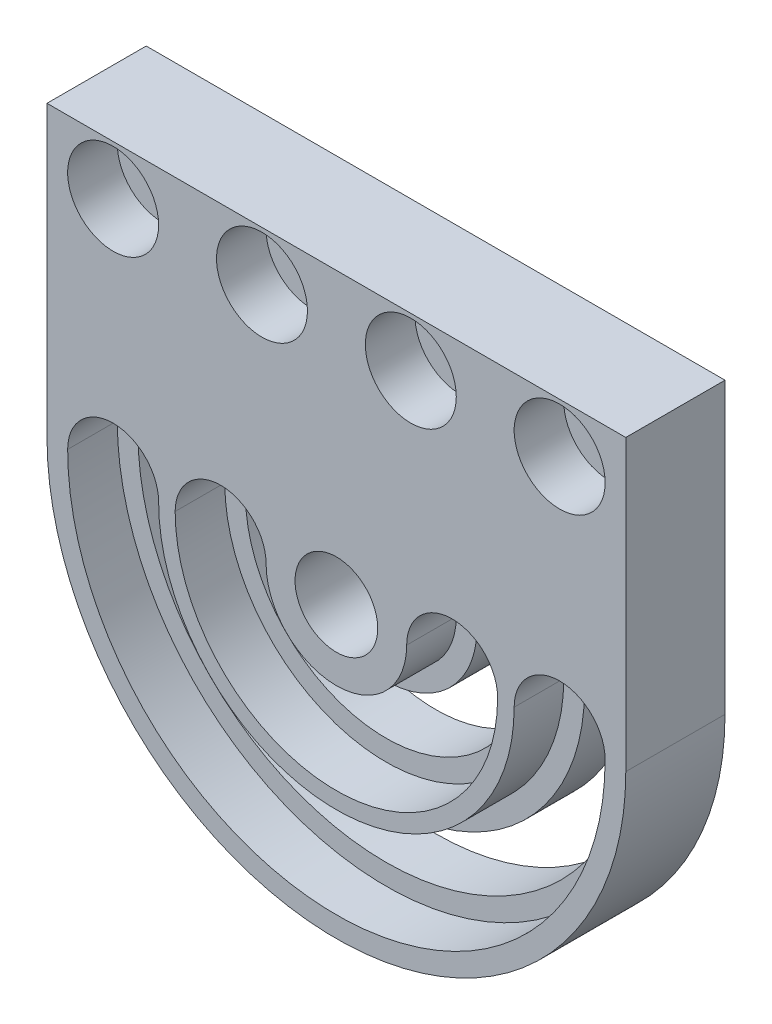
ISO-10303-21;
HEADER;
FILE_DESCRIPTION(('STEP AP214'),'2;1');
FILE_NAME('part.step','',(''),(''),'','','');
FILE_SCHEMA(('AUTOMOTIVE_DESIGN { 1 0 10303 214 1 1 1 1 }'));
ENDSEC;
DATA;
#1=APPLICATION_CONTEXT('core data for automotive mechanical design processes');
#2=APPLICATION_PROTOCOL_DEFINITION('international standard','automotive_design',2000,#1);
#3=PRODUCT_CONTEXT('',#1,'mechanical');
#4=PRODUCT('Part','Part','',(#3));
#5=PRODUCT_RELATED_PRODUCT_CATEGORY('part','',(#4));
#6=PRODUCT_DEFINITION_FORMATION('','',#4);
#7=PRODUCT_DEFINITION_CONTEXT('part definition',#1,'design');
#8=PRODUCT_DEFINITION('design','',#6,#7);
#9=PRODUCT_DEFINITION_SHAPE('','',#8);
#10=(LENGTH_UNIT() NAMED_UNIT(*) SI_UNIT(.MILLI.,.METRE.));
#11=(NAMED_UNIT(*) PLANE_ANGLE_UNIT() SI_UNIT($,.RADIAN.));
#12=(NAMED_UNIT(*) SI_UNIT($,.STERADIAN.) SOLID_ANGLE_UNIT());
#13=UNCERTAINTY_MEASURE_WITH_UNIT(LENGTH_MEASURE(1.E-05),#10,'distance_accuracy_value','');
#14=(GEOMETRIC_REPRESENTATION_CONTEXT(3) GLOBAL_UNCERTAINTY_ASSIGNED_CONTEXT((#13)) GLOBAL_UNIT_ASSIGNED_CONTEXT((#10,
#11,#12)) REPRESENTATION_CONTEXT('',''));
#15=CARTESIAN_POINT('',(0.,0.,0.));
#16=DIRECTION('',(0.,0.,1.));
#17=DIRECTION('',(1.,0.,0.));
#18=AXIS2_PLACEMENT_3D('',#15,#16,#17);
#19=CARTESIAN_POINT('',(-27.,29.,12.));
#20=DIRECTION('',(0.,0.,-1.));
#21=DIRECTION('',(-1.,0.,0.));
#22=AXIS2_PLACEMENT_3D('',#19,#20,#21);
#23=CYLINDRICAL_SURFACE('',#22,3.);
#24=CARTESIAN_POINT('',(-27.,29.,0.));
#25=DIRECTION('',(0.,0.,1.));
#26=DIRECTION('',(1.,0.,0.));
#27=AXIS2_PLACEMENT_3D('',#24,#25,#26);
#28=CIRCLE('',#27,3.);
#29=CARTESIAN_POINT('',(-24.,29.,0.));
#30=VERTEX_POINT('',#29);
#31=EDGE_CURVE('E332',#30,#30,#28,.T.);
#32=ORIENTED_EDGE('',*,*,#31,.F.);
#33=EDGE_LOOP('',(#32));
#34=FACE_BOUND('',#33,.T.);
#35=CARTESIAN_POINT('',(-27.,29.,6.));
#36=DIRECTION('',(0.,0.,1.));
#37=DIRECTION('',(1.,0.,0.));
#38=AXIS2_PLACEMENT_3D('',#35,#36,#37);
#39=CIRCLE('',#38,3.);
#40=CARTESIAN_POINT('',(-24.,29.,6.));
#41=VERTEX_POINT('',#40);
#42=EDGE_CURVE('E37',#41,#41,#39,.T.);
#43=ORIENTED_EDGE('',*,*,#42,.T.);
#44=EDGE_LOOP('',(#43));
#45=FACE_BOUND('',#44,.T.);
#46=ADVANCED_FACE('F33',(#34,#45),#23,.F.);
#47=CARTESIAN_POINT('',(-9.00000000000001,29.,12.));
#48=DIRECTION('',(0.,0.,-1.));
#49=DIRECTION('',(-1.,0.,0.));
#50=AXIS2_PLACEMENT_3D('',#47,#48,#49);
#51=CYLINDRICAL_SURFACE('',#50,3.);
#52=CARTESIAN_POINT('',(-9.00000000000001,29.,0.));
#53=DIRECTION('',(0.,0.,1.));
#54=DIRECTION('',(1.,0.,0.));
#55=AXIS2_PLACEMENT_3D('',#52,#53,#54);
#56=CIRCLE('',#55,3.);
#57=CARTESIAN_POINT('',(-6.,29.,0.));
#58=VERTEX_POINT('',#57);
#59=EDGE_CURVE('E329',#58,#58,#56,.T.);
#60=ORIENTED_EDGE('',*,*,#59,.F.);
#61=EDGE_LOOP('',(#60));
#62=FACE_BOUND('',#61,.T.);
#63=CARTESIAN_POINT('',(-9.00000000000001,29.,6.));
#64=DIRECTION('',(0.,0.,1.));
#65=DIRECTION('',(1.,0.,0.));
#66=AXIS2_PLACEMENT_3D('',#63,#64,#65);
#67=CIRCLE('',#66,3.);
#68=CARTESIAN_POINT('',(-6.,29.,6.));
#69=VERTEX_POINT('',#68);
#70=EDGE_CURVE('E377',#69,#69,#67,.T.);
#71=ORIENTED_EDGE('',*,*,#70,.T.);
#72=EDGE_LOOP('',(#71));
#73=FACE_BOUND('',#72,.T.);
#74=ADVANCED_FACE('F491',(#62,#73),#51,.F.);
#75=CARTESIAN_POINT('',(8.99999999999999,29.,12.));
#76=DIRECTION('',(0.,0.,-1.));
#77=DIRECTION('',(-1.,0.,0.));
#78=AXIS2_PLACEMENT_3D('',#75,#76,#77);
#79=CYLINDRICAL_SURFACE('',#78,3.);
#80=CARTESIAN_POINT('',(8.99999999999999,29.,0.));
#81=DIRECTION('',(0.,0.,1.));
#82=DIRECTION('',(1.,0.,0.));
#83=AXIS2_PLACEMENT_3D('',#80,#81,#82);
#84=CIRCLE('',#83,3.);
#85=CARTESIAN_POINT('',(12.,29.,0.));
#86=VERTEX_POINT('',#85);
#87=EDGE_CURVE('E326',#86,#86,#84,.T.);
#88=ORIENTED_EDGE('',*,*,#87,.F.);
#89=EDGE_LOOP('',(#88));
#90=FACE_BOUND('',#89,.T.);
#91=CARTESIAN_POINT('',(8.99999999999999,29.,6.));
#92=DIRECTION('',(0.,0.,1.));
#93=DIRECTION('',(1.,0.,0.));
#94=AXIS2_PLACEMENT_3D('',#91,#92,#93);
#95=CIRCLE('',#94,3.);
#96=CARTESIAN_POINT('',(12.,29.,6.));
#97=VERTEX_POINT('',#96);
#98=EDGE_CURVE('E375',#97,#97,#95,.T.);
#99=ORIENTED_EDGE('',*,*,#98,.T.);
#100=EDGE_LOOP('',(#99));
#101=FACE_BOUND('',#100,.T.);
#102=ADVANCED_FACE('F497',(#90,#101),#79,.F.);
#103=CARTESIAN_POINT('',(27.,29.,12.));
#104=DIRECTION('',(0.,0.,-1.));
#105=DIRECTION('',(-1.,0.,0.));
#106=AXIS2_PLACEMENT_3D('',#103,#104,#105);
#107=CYLINDRICAL_SURFACE('',#106,3.);
#108=CARTESIAN_POINT('',(27.,29.,0.));
#109=DIRECTION('',(0.,0.,1.));
#110=DIRECTION('',(1.,0.,0.));
#111=AXIS2_PLACEMENT_3D('',#108,#109,#110);
#112=CIRCLE('',#111,3.);
#113=CARTESIAN_POINT('',(30.,29.,0.));
#114=VERTEX_POINT('',#113);
#115=EDGE_CURVE('E323',#114,#114,#112,.T.);
#116=ORIENTED_EDGE('',*,*,#115,.F.);
#117=EDGE_LOOP('',(#116));
#118=FACE_BOUND('',#117,.T.);
#119=CARTESIAN_POINT('',(27.,29.,6.));
#120=DIRECTION('',(0.,0.,1.));
#121=DIRECTION('',(1.,0.,0.));
#122=AXIS2_PLACEMENT_3D('',#119,#120,#121);
#123=CIRCLE('',#122,3.);
#124=CARTESIAN_POINT('',(30.,29.,6.));
#125=VERTEX_POINT('',#124);
#126=EDGE_CURVE('E282',#125,#125,#123,.T.);
#127=ORIENTED_EDGE('',*,*,#126,.T.);
#128=EDGE_LOOP('',(#127));
#129=FACE_BOUND('',#128,.T.);
#130=ADVANCED_FACE('F590',(#118,#129),#107,.F.);
#131=CARTESIAN_POINT('',(0.,0.,12.));
#132=DIRECTION('',(0.,0.,-1.));
#133=DIRECTION('',(-1.,0.,0.));
#134=AXIS2_PLACEMENT_3D('',#131,#132,#133);
#135=CYLINDRICAL_SURFACE('',#134,11.);
#136=DIRECTION('',(0.,0.,-1.));
#137=VECTOR('',#136,1.);
#138=CARTESIAN_POINT('',(11.,0.,12.));
#139=LINE('',#138,#137);
#140=CARTESIAN_POINT('',(11.,0.,6.));
#141=VERTEX_POINT('',#140);
#142=CARTESIAN_POINT('',(11.,0.,0.));
#143=VERTEX_POINT('',#142);
#144=EDGE_CURVE('E315',#141,#143,#139,.T.);
#145=ORIENTED_EDGE('',*,*,#144,.F.);
#146=CARTESIAN_POINT('',(0.,0.,6.));
#147=DIRECTION('',(0.,0.,1.));
#148=DIRECTION('',(1.,0.,0.));
#149=AXIS2_PLACEMENT_3D('',#146,#147,#148);
#150=CIRCLE('',#149,11.);
#151=CARTESIAN_POINT('',(-11.,0.,6.));
#152=VERTEX_POINT('',#151);
#153=EDGE_CURVE('E279',#141,#152,#150,.F.);
#154=ORIENTED_EDGE('',*,*,#153,.T.);
#155=DIRECTION('',(0.,0.,-1.));
#156=VECTOR('',#155,1.);
#157=CARTESIAN_POINT('',(-11.,0.,12.));
#158=LINE('',#157,#156);
#159=CARTESIAN_POINT('',(-11.,0.,0.));
#160=VERTEX_POINT('',#159);
#161=EDGE_CURVE('E321',#152,#160,#158,.T.);
#162=ORIENTED_EDGE('',*,*,#161,.T.);
#163=CARTESIAN_POINT('',(0.,0.,0.));
#164=DIRECTION('',(0.,0.,-1.));
#165=DIRECTION('',(1.,0.,0.));
#166=AXIS2_PLACEMENT_3D('',#163,#164,#165);
#167=CIRCLE('',#166,11.);
#168=EDGE_CURVE('E303',#143,#160,#167,.T.);
#169=ORIENTED_EDGE('',*,*,#168,.F.);
#170=EDGE_LOOP('',(#145,#154,#162,#169));
#171=FACE_BOUND('',#170,.T.);
#172=ADVANCED_FACE('F582',(#171),#135,.T.);
#173=CARTESIAN_POINT('',(-14.,0.,12.));
#174=DIRECTION('',(0.,0.,-1.));
#175=DIRECTION('',(-1.,0.,0.));
#176=AXIS2_PLACEMENT_3D('',#173,#174,#175);
#177=CYLINDRICAL_SURFACE('',#176,3.);
#178=ORIENTED_EDGE('',*,*,#161,.F.);
#179=CARTESIAN_POINT('',(-14.,0.,6.));
#180=DIRECTION('',(0.,0.,1.));
#181=DIRECTION('',(1.,0.,0.));
#182=AXIS2_PLACEMENT_3D('',#179,#180,#181);
#183=CIRCLE('',#182,3.);
#184=CARTESIAN_POINT('',(-17.,0.,6.));
#185=VERTEX_POINT('',#184);
#186=EDGE_CURVE('E276',#152,#185,#183,.T.);
#187=ORIENTED_EDGE('',*,*,#186,.T.);
#188=DIRECTION('',(0.,0.,-1.));
#189=VECTOR('',#188,1.);
#190=CARTESIAN_POINT('',(-17.,0.,12.));
#191=LINE('',#190,#189);
#192=CARTESIAN_POINT('',(-17.,0.,0.));
#193=VERTEX_POINT('',#192);
#194=EDGE_CURVE('E319',#185,#193,#191,.T.);
#195=ORIENTED_EDGE('',*,*,#194,.T.);
#196=CARTESIAN_POINT('',(-14.,0.,0.));
#197=DIRECTION('',(0.,0.,1.));
#198=DIRECTION('',(-1.,0.,0.));
#199=AXIS2_PLACEMENT_3D('',#196,#197,#198);
#200=CIRCLE('',#199,3.);
#201=EDGE_CURVE('E306',#160,#193,#200,.T.);
#202=ORIENTED_EDGE('',*,*,#201,.F.);
#203=EDGE_LOOP('',(#178,#187,#195,#202));
#204=FACE_BOUND('',#203,.T.);
#205=ADVANCED_FACE('F574',(#204),#177,.F.);
#206=CARTESIAN_POINT('',(0.,0.,12.));
#207=DIRECTION('',(0.,0.,-1.));
#208=DIRECTION('',(-1.,0.,0.));
#209=AXIS2_PLACEMENT_3D('',#206,#207,#208);
#210=CYLINDRICAL_SURFACE('',#209,17.);
#211=ORIENTED_EDGE('',*,*,#194,.F.);
#212=CARTESIAN_POINT('',(0.,0.,6.));
#213=DIRECTION('',(0.,0.,1.));
#214=DIRECTION('',(1.,0.,0.));
#215=AXIS2_PLACEMENT_3D('',#212,#213,#214);
#216=CIRCLE('',#215,17.);
#217=CARTESIAN_POINT('',(17.,0.,6.));
#218=VERTEX_POINT('',#217);
#219=EDGE_CURVE('E273',#185,#218,#216,.T.);
#220=ORIENTED_EDGE('',*,*,#219,.T.);
#221=DIRECTION('',(0.,0.,-1.));
#222=VECTOR('',#221,1.);
#223=CARTESIAN_POINT('',(17.,0.,12.));
#224=LINE('',#223,#222);
#225=CARTESIAN_POINT('',(17.,0.,0.));
#226=VERTEX_POINT('',#225);
#227=EDGE_CURVE('E317',#218,#226,#224,.T.);
#228=ORIENTED_EDGE('',*,*,#227,.T.);
#229=CARTESIAN_POINT('',(0.,0.,0.));
#230=DIRECTION('',(0.,0.,1.));
#231=DIRECTION('',(1.,0.,0.));
#232=AXIS2_PLACEMENT_3D('',#229,#230,#231);
#233=CIRCLE('',#232,17.);
#234=EDGE_CURVE('E309',#193,#226,#233,.T.);
#235=ORIENTED_EDGE('',*,*,#234,.F.);
#236=EDGE_LOOP('',(#211,#220,#228,#235));
#237=FACE_BOUND('',#236,.T.);
#238=ADVANCED_FACE('F566',(#237),#210,.F.);
#239=CARTESIAN_POINT('',(14.,0.,12.));
#240=DIRECTION('',(0.,0.,-1.));
#241=DIRECTION('',(-1.,0.,0.));
#242=AXIS2_PLACEMENT_3D('',#239,#240,#241);
#243=CYLINDRICAL_SURFACE('',#242,3.);
#244=ORIENTED_EDGE('',*,*,#227,.F.);
#245=CARTESIAN_POINT('',(14.,0.,6.));
#246=DIRECTION('',(0.,0.,1.));
#247=DIRECTION('',(1.,0.,0.));
#248=AXIS2_PLACEMENT_3D('',#245,#246,#247);
#249=CIRCLE('',#248,3.);
#250=EDGE_CURVE('E11',#218,#141,#249,.T.);
#251=ORIENTED_EDGE('',*,*,#250,.T.);
#252=ORIENTED_EDGE('',*,*,#144,.T.);
#253=CARTESIAN_POINT('',(14.,0.,0.));
#254=DIRECTION('',(0.,0.,1.));
#255=DIRECTION('',(1.,0.,0.));
#256=AXIS2_PLACEMENT_3D('',#253,#254,#255);
#257=CIRCLE('',#256,3.);
#258=EDGE_CURVE('E312',#226,#143,#257,.T.);
#259=ORIENTED_EDGE('',*,*,#258,.F.);
#260=EDGE_LOOP('',(#244,#251,#252,#259));
#261=FACE_BOUND('',#260,.T.);
#262=ADVANCED_FACE('F559',(#261),#243,.F.);
#263=CARTESIAN_POINT('',(0.,0.,12.));
#264=DIRECTION('',(0.,0.,-1.));
#265=DIRECTION('',(-1.,0.,0.));
#266=AXIS2_PLACEMENT_3D('',#263,#264,#265);
#267=CYLINDRICAL_SURFACE('',#266,24.);
#268=DIRECTION('',(0.,0.,-1.));
#269=VECTOR('',#268,1.);
#270=CARTESIAN_POINT('',(24.,0.,12.));
#271=LINE('',#270,#269);
#272=CARTESIAN_POINT('',(24.,0.,6.));
#273=VERTEX_POINT('',#272);
#274=CARTESIAN_POINT('',(24.,0.,0.));
#275=VERTEX_POINT('',#274);
#276=EDGE_CURVE('E295',#273,#275,#271,.T.);
#277=ORIENTED_EDGE('',*,*,#276,.F.);
#278=CARTESIAN_POINT('',(0.,0.,6.));
#279=DIRECTION('',(0.,0.,1.));
#280=DIRECTION('',(1.,0.,0.));
#281=AXIS2_PLACEMENT_3D('',#278,#279,#280);
#282=CIRCLE('',#281,24.);
#283=CARTESIAN_POINT('',(-24.,0.,6.));
#284=VERTEX_POINT('',#283);
#285=EDGE_CURVE('E270',#273,#284,#282,.F.);
#286=ORIENTED_EDGE('',*,*,#285,.T.);
#287=DIRECTION('',(0.,0.,-1.));
#288=VECTOR('',#287,1.);
#289=CARTESIAN_POINT('',(-24.,0.,12.));
#290=LINE('',#289,#288);
#291=CARTESIAN_POINT('',(-24.,0.,0.));
#292=VERTEX_POINT('',#291);
#293=EDGE_CURVE('E301',#284,#292,#290,.T.);
#294=ORIENTED_EDGE('',*,*,#293,.T.);
#295=CARTESIAN_POINT('',(0.,0.,0.));
#296=DIRECTION('',(0.,0.,-1.));
#297=DIRECTION('',(1.,0.,0.));
#298=AXIS2_PLACEMENT_3D('',#295,#296,#297);
#299=CIRCLE('',#298,24.);
#300=EDGE_CURVE('E283',#275,#292,#299,.T.);
#301=ORIENTED_EDGE('',*,*,#300,.F.);
#302=EDGE_LOOP('',(#277,#286,#294,#301));
#303=FACE_BOUND('',#302,.T.);
#304=ADVANCED_FACE('F439',(#303),#267,.T.);
#305=CARTESIAN_POINT('',(-27.,0.,12.));
#306=DIRECTION('',(0.,0.,-1.));
#307=DIRECTION('',(-1.,0.,0.));
#308=AXIS2_PLACEMENT_3D('',#305,#306,#307);
#309=CYLINDRICAL_SURFACE('',#308,3.);
#310=ORIENTED_EDGE('',*,*,#293,.F.);
#311=CARTESIAN_POINT('',(-27.,0.,6.));
#312=DIRECTION('',(0.,0.,1.));
#313=DIRECTION('',(1.,0.,0.));
#314=AXIS2_PLACEMENT_3D('',#311,#312,#313);
#315=CIRCLE('',#314,3.);
#316=CARTESIAN_POINT('',(-30.,0.,6.));
#317=VERTEX_POINT('',#316);
#318=EDGE_CURVE('E267',#284,#317,#315,.T.);
#319=ORIENTED_EDGE('',*,*,#318,.T.);
#320=DIRECTION('',(0.,0.,-1.));
#321=VECTOR('',#320,1.);
#322=CARTESIAN_POINT('',(-30.,0.,12.));
#323=LINE('',#322,#321);
#324=CARTESIAN_POINT('',(-30.,0.,0.));
#325=VERTEX_POINT('',#324);
#326=EDGE_CURVE('E299',#317,#325,#323,.T.);
#327=ORIENTED_EDGE('',*,*,#326,.T.);
#328=CARTESIAN_POINT('',(-27.,0.,0.));
#329=DIRECTION('',(0.,0.,1.));
#330=DIRECTION('',(-1.,0.,0.));
#331=AXIS2_PLACEMENT_3D('',#328,#329,#330);
#332=CIRCLE('',#331,3.);
#333=EDGE_CURVE('E286',#292,#325,#332,.T.);
#334=ORIENTED_EDGE('',*,*,#333,.F.);
#335=EDGE_LOOP('',(#310,#319,#327,#334));
#336=FACE_BOUND('',#335,.T.);
#337=ADVANCED_FACE('F442',(#336),#309,.F.);
#338=CARTESIAN_POINT('',(0.,0.,12.));
#339=DIRECTION('',(0.,0.,-1.));
#340=DIRECTION('',(-1.,0.,0.));
#341=AXIS2_PLACEMENT_3D('',#338,#339,#340);
#342=CYLINDRICAL_SURFACE('',#341,30.);
#343=ORIENTED_EDGE('',*,*,#326,.F.);
#344=CARTESIAN_POINT('',(0.,0.,6.));
#345=DIRECTION('',(0.,0.,1.));
#346=DIRECTION('',(1.,0.,0.));
#347=AXIS2_PLACEMENT_3D('',#344,#345,#346);
#348=CIRCLE('',#347,30.);
#349=CARTESIAN_POINT('',(30.,0.,6.));
#350=VERTEX_POINT('',#349);
#351=EDGE_CURVE('E262',#317,#350,#348,.T.);
#352=ORIENTED_EDGE('',*,*,#351,.T.);
#353=DIRECTION('',(0.,0.,-1.));
#354=VECTOR('',#353,1.);
#355=CARTESIAN_POINT('',(30.,0.,12.));
#356=LINE('',#355,#354);
#357=CARTESIAN_POINT('',(30.,0.,0.));
#358=VERTEX_POINT('',#357);
#359=EDGE_CURVE('E297',#350,#358,#356,.T.);
#360=ORIENTED_EDGE('',*,*,#359,.T.);
#361=CARTESIAN_POINT('',(0.,0.,0.));
#362=DIRECTION('',(0.,0.,1.));
#363=DIRECTION('',(1.,0.,0.));
#364=AXIS2_PLACEMENT_3D('',#361,#362,#363);
#365=CIRCLE('',#364,30.);
#366=EDGE_CURVE('E289',#325,#358,#365,.T.);
#367=ORIENTED_EDGE('',*,*,#366,.F.);
#368=EDGE_LOOP('',(#343,#352,#360,#367));
#369=FACE_BOUND('',#368,.T.);
#370=ADVANCED_FACE('F446',(#369),#342,.F.);
#371=CARTESIAN_POINT('',(27.,0.,12.));
#372=DIRECTION('',(0.,0.,-1.));
#373=DIRECTION('',(-1.,0.,0.));
#374=AXIS2_PLACEMENT_3D('',#371,#372,#373);
#375=CYLINDRICAL_SURFACE('',#374,3.);
#376=ORIENTED_EDGE('',*,*,#359,.F.);
#377=CARTESIAN_POINT('',(27.,0.,6.));
#378=DIRECTION('',(0.,0.,1.));
#379=DIRECTION('',(1.,0.,0.));
#380=AXIS2_PLACEMENT_3D('',#377,#378,#379);
#381=CIRCLE('',#380,3.);
#382=EDGE_CURVE('E42',#350,#273,#381,.T.);
#383=ORIENTED_EDGE('',*,*,#382,.T.);
#384=ORIENTED_EDGE('',*,*,#276,.T.);
#385=CARTESIAN_POINT('',(27.,0.,0.));
#386=DIRECTION('',(0.,0.,1.));
#387=DIRECTION('',(1.,0.,0.));
#388=AXIS2_PLACEMENT_3D('',#385,#386,#387);
#389=CIRCLE('',#388,3.);
#390=EDGE_CURVE('E292',#358,#275,#389,.T.);
#391=ORIENTED_EDGE('',*,*,#390,.F.);
#392=EDGE_LOOP('',(#376,#383,#384,#391));
#393=FACE_BOUND('',#392,.T.);
#394=ADVANCED_FACE('F402',(#393),#375,.F.);
#395=CARTESIAN_POINT('',(0.,0.,12.));
#396=DIRECTION('',(0.,0.,1.));
#397=DIRECTION('',(1.,0.,0.));
#398=AXIS2_PLACEMENT_3D('',#395,#396,#397);
#399=PLANE('',#398);
#400=CARTESIAN_POINT('',(0.,0.,12.));
#401=DIRECTION('',(0.,0.,1.));
#402=DIRECTION('',(1.,0.,0.));
#403=AXIS2_PLACEMENT_3D('',#400,#401,#402);
#404=CIRCLE('',#403,32.5);
#405=CARTESIAN_POINT('',(-32.5,0.,12.));
#406=VERTEX_POINT('',#405);
#407=CARTESIAN_POINT('',(32.5,0.,12.));
#408=VERTEX_POINT('',#407);
#409=EDGE_CURVE('E50',#406,#408,#404,.T.);
#410=ORIENTED_EDGE('',*,*,#409,.F.);
#411=CARTESIAN_POINT('',(-27.,0.,12.));
#412=DIRECTION('',(0.,0.,1.));
#413=DIRECTION('',(1.,0.,0.));
#414=AXIS2_PLACEMENT_3D('',#411,#412,#413);
#415=CIRCLE('',#414,5.5);
#416=CARTESIAN_POINT('',(-21.5,0.,12.));
#417=VERTEX_POINT('',#416);
#418=EDGE_CURVE('E222',#417,#406,#415,.T.);
#419=ORIENTED_EDGE('',*,*,#418,.F.);
#420=CARTESIAN_POINT('',(0.,0.,12.));
#421=DIRECTION('',(0.,0.,-1.));
#422=DIRECTION('',(1.,0.,0.));
#423=AXIS2_PLACEMENT_3D('',#420,#421,#422);
#424=CIRCLE('',#423,21.5);
#425=CARTESIAN_POINT('',(21.5,0.,12.));
#426=VERTEX_POINT('',#425);
#427=EDGE_CURVE('E236',#426,#417,#424,.T.);
#428=ORIENTED_EDGE('',*,*,#427,.F.);
#429=CARTESIAN_POINT('',(27.,0.,12.));
#430=DIRECTION('',(0.,0.,1.));
#431=DIRECTION('',(1.,0.,0.));
#432=AXIS2_PLACEMENT_3D('',#429,#430,#431);
#433=CIRCLE('',#432,5.5);
#434=EDGE_CURVE('E233',#408,#426,#433,.T.);
#435=ORIENTED_EDGE('',*,*,#434,.F.);
#436=EDGE_LOOP('',(#410,#419,#428,#435));
#437=FACE_BOUND('',#436,.T.);
#438=CARTESIAN_POINT('',(27.,29.,12.));
#439=DIRECTION('',(0.,0.,1.));
#440=DIRECTION('',(1.,0.,0.));
#441=AXIS2_PLACEMENT_3D('',#438,#439,#440);
#442=CIRCLE('',#441,5.5);
#443=CARTESIAN_POINT('',(32.5,29.,12.));
#444=VERTEX_POINT('',#443);
#445=EDGE_CURVE('E214',#444,#444,#442,.T.);
#446=ORIENTED_EDGE('',*,*,#445,.F.);
#447=EDGE_LOOP('',(#446));
#448=FACE_BOUND('',#447,.T.);
#449=CARTESIAN_POINT('',(8.99999999999999,29.,12.));
#450=DIRECTION('',(0.,0.,1.));
#451=DIRECTION('',(1.,0.,0.));
#452=AXIS2_PLACEMENT_3D('',#449,#450,#451);
#453=CIRCLE('',#452,5.5);
#454=CARTESIAN_POINT('',(14.5,29.,12.));
#455=VERTEX_POINT('',#454);
#456=EDGE_CURVE('E213',#455,#455,#453,.T.);
#457=ORIENTED_EDGE('',*,*,#456,.F.);
#458=EDGE_LOOP('',(#457));
#459=FACE_BOUND('',#458,.T.);
#460=CARTESIAN_POINT('',(-27.,29.,12.));
#461=DIRECTION('',(0.,0.,1.));
#462=DIRECTION('',(1.,0.,0.));
#463=AXIS2_PLACEMENT_3D('',#460,#461,#462);
#464=CIRCLE('',#463,5.5);
#465=CARTESIAN_POINT('',(-21.5,29.,12.));
#466=VERTEX_POINT('',#465);
#467=EDGE_CURVE('E251',#466,#466,#464,.T.);
#468=ORIENTED_EDGE('',*,*,#467,.F.);
#469=EDGE_LOOP('',(#468));
#470=FACE_BOUND('',#469,.T.);
#471=CARTESIAN_POINT('',(0.,0.,12.));
#472=DIRECTION('',(0.,0.,1.));
#473=DIRECTION('',(1.,0.,0.));
#474=AXIS2_PLACEMENT_3D('',#471,#472,#473);
#475=CIRCLE('',#474,19.5);
#476=CARTESIAN_POINT('',(-19.5,0.,12.));
#477=VERTEX_POINT('',#476);
#478=CARTESIAN_POINT('',(19.5,0.,12.));
#479=VERTEX_POINT('',#478);
#480=EDGE_CURVE('E58',#477,#479,#475,.T.);
#481=ORIENTED_EDGE('',*,*,#480,.F.);
#482=CARTESIAN_POINT('',(-14.,0.,12.));
#483=DIRECTION('',(0.,0.,1.));
#484=DIRECTION('',(1.,0.,0.));
#485=AXIS2_PLACEMENT_3D('',#482,#483,#484);
#486=CIRCLE('',#485,5.5);
#487=CARTESIAN_POINT('',(-8.50000000000001,0.,12.));
#488=VERTEX_POINT('',#487);
#489=EDGE_CURVE('E192',#488,#477,#486,.T.);
#490=ORIENTED_EDGE('',*,*,#489,.F.);
#491=CARTESIAN_POINT('',(0.,0.,12.));
#492=DIRECTION('',(0.,0.,-1.));
#493=DIRECTION('',(1.,0.,0.));
#494=AXIS2_PLACEMENT_3D('',#491,#492,#493);
#495=CIRCLE('',#494,8.50000000000001);
#496=CARTESIAN_POINT('',(8.5,0.,12.));
#497=VERTEX_POINT('',#496);
#498=EDGE_CURVE('E195',#497,#488,#495,.T.);
#499=ORIENTED_EDGE('',*,*,#498,.F.);
#500=CARTESIAN_POINT('',(14.,0.,12.));
#501=DIRECTION('',(0.,0.,1.));
#502=DIRECTION('',(1.,0.,0.));
#503=AXIS2_PLACEMENT_3D('',#500,#501,#502);
#504=CIRCLE('',#503,5.5);
#505=EDGE_CURVE('E201',#479,#497,#504,.T.);
#506=ORIENTED_EDGE('',*,*,#505,.F.);
#507=EDGE_LOOP('',(#481,#490,#499,#506));
#508=FACE_BOUND('',#507,.T.);
#509=CARTESIAN_POINT('',(-9.00000000000001,29.,12.));
#510=DIRECTION('',(0.,0.,1.));
#511=DIRECTION('',(1.,0.,0.));
#512=AXIS2_PLACEMENT_3D('',#509,#510,#511);
#513=CIRCLE('',#512,5.5);
#514=CARTESIAN_POINT('',(-3.5,29.,12.));
#515=VERTEX_POINT('',#514);
#516=EDGE_CURVE('E250',#515,#515,#513,.T.);
#517=ORIENTED_EDGE('',*,*,#516,.F.);
#518=EDGE_LOOP('',(#517));
#519=FACE_BOUND('',#518,.T.);
#520=CARTESIAN_POINT('',(0.,0.,12.));
#521=DIRECTION('',(0.,0.,1.));
#522=DIRECTION('',(1.,0.,0.));
#523=AXIS2_PLACEMENT_3D('',#520,#521,#522);
#524=CIRCLE('',#523,35.);
#525=CARTESIAN_POINT('',(-35.,0.,12.));
#526=VERTEX_POINT('',#525);
#527=CARTESIAN_POINT('',(35.,0.,12.));
#528=VERTEX_POINT('',#527);
#529=EDGE_CURVE('E342',#526,#528,#524,.T.);
#530=ORIENTED_EDGE('',*,*,#529,.T.);
#531=DIRECTION('',(0.,1.,0.));
#532=VECTOR('',#531,1.);
#533=CARTESIAN_POINT('',(35.,35.,12.));
#534=LINE('',#533,#532);
#535=CARTESIAN_POINT('',(35.,35.,12.));
#536=VERTEX_POINT('',#535);
#537=EDGE_CURVE('E345',#528,#536,#534,.T.);
#538=ORIENTED_EDGE('',*,*,#537,.T.);
#539=DIRECTION('',(-1.,0.,0.));
#540=VECTOR('',#539,1.);
#541=CARTESIAN_POINT('',(-35.,35.,12.));
#542=LINE('',#541,#540);
#543=CARTESIAN_POINT('',(-35.,35.,12.));
#544=VERTEX_POINT('',#543);
#545=EDGE_CURVE('E348',#536,#544,#542,.T.);
#546=ORIENTED_EDGE('',*,*,#545,.T.);
#547=DIRECTION('',(0.,-1.,0.));
#548=VECTOR('',#547,1.);
#549=CARTESIAN_POINT('',(-35.,0.,12.));
#550=LINE('',#549,#548);
#551=EDGE_CURVE('E350',#544,#526,#550,.T.);
#552=ORIENTED_EDGE('',*,*,#551,.T.);
#553=EDGE_LOOP('',(#530,#538,#546,#552));
#554=FACE_BOUND('',#553,.T.);
#555=CARTESIAN_POINT('',(0.,0.,12.));
#556=DIRECTION('',(0.,0.,1.));
#557=DIRECTION('',(1.,0.,0.));
#558=AXIS2_PLACEMENT_3D('',#555,#556,#557);
#559=CIRCLE('',#558,5.);
#560=CARTESIAN_POINT('',(5.,0.,12.));
#561=VERTEX_POINT('',#560);
#562=EDGE_CURVE('E336',#561,#561,#559,.T.);
#563=ORIENTED_EDGE('',*,*,#562,.F.);
#564=EDGE_LOOP('',(#563));
#565=FACE_BOUND('',#564,.T.);
#566=ADVANCED_FACE('F398',(#437,#448,#459,#470,#508,#519,#554,#565),#399,.T.);
#567=CARTESIAN_POINT('',(0.,0.,0.));
#568=DIRECTION('',(0.,0.,1.));
#569=DIRECTION('',(1.,0.,0.));
#570=AXIS2_PLACEMENT_3D('',#567,#568,#569);
#571=PLANE('',#570);
#572=ORIENTED_EDGE('',*,*,#168,.T.);
#573=ORIENTED_EDGE('',*,*,#201,.T.);
#574=ORIENTED_EDGE('',*,*,#234,.T.);
#575=ORIENTED_EDGE('',*,*,#258,.T.);
#576=EDGE_LOOP('',(#572,#573,#574,#575));
#577=FACE_BOUND('',#576,.T.);
#578=CARTESIAN_POINT('',(0.,0.,0.));
#579=DIRECTION('',(0.,0.,1.));
#580=DIRECTION('',(1.,0.,0.));
#581=AXIS2_PLACEMENT_3D('',#578,#579,#580);
#582=CIRCLE('',#581,35.);
#583=CARTESIAN_POINT('',(-35.,0.,0.));
#584=VERTEX_POINT('',#583);
#585=CARTESIAN_POINT('',(35.,0.,0.));
#586=VERTEX_POINT('',#585);
#587=EDGE_CURVE('E339',#584,#586,#582,.T.);
#588=ORIENTED_EDGE('',*,*,#587,.F.);
#589=DIRECTION('',(0.,-1.,0.));
#590=VECTOR('',#589,1.);
#591=CARTESIAN_POINT('',(-35.,0.,0.));
#592=LINE('',#591,#590);
#593=CARTESIAN_POINT('',(-35.,35.,0.));
#594=VERTEX_POINT('',#593);
#595=EDGE_CURVE('E346',#594,#584,#592,.T.);
#596=ORIENTED_EDGE('',*,*,#595,.F.);
#597=DIRECTION('',(-1.,0.,0.));
#598=VECTOR('',#597,1.);
#599=CARTESIAN_POINT('',(-35.,35.,0.));
#600=LINE('',#599,#598);
#601=CARTESIAN_POINT('',(35.,35.,0.));
#602=VERTEX_POINT('',#601);
#603=EDGE_CURVE('E357',#602,#594,#600,.T.);
#604=ORIENTED_EDGE('',*,*,#603,.F.);
#605=DIRECTION('',(0.,1.,0.));
#606=VECTOR('',#605,1.);
#607=CARTESIAN_POINT('',(35.,35.,0.));
#608=LINE('',#607,#606);
#609=EDGE_CURVE('E355',#586,#602,#608,.T.);
#610=ORIENTED_EDGE('',*,*,#609,.F.);
#611=EDGE_LOOP('',(#588,#596,#604,#610));
#612=FACE_BOUND('',#611,.T.);
#613=CARTESIAN_POINT('',(0.,0.,0.));
#614=DIRECTION('',(0.,0.,1.));
#615=DIRECTION('',(1.,0.,0.));
#616=AXIS2_PLACEMENT_3D('',#613,#614,#615);
#617=CIRCLE('',#616,5.);
#618=CARTESIAN_POINT('',(5.,0.,0.));
#619=VERTEX_POINT('',#618);
#620=EDGE_CURVE('E335',#619,#619,#617,.T.);
#621=ORIENTED_EDGE('',*,*,#620,.T.);
#622=EDGE_LOOP('',(#621));
#623=FACE_BOUND('',#622,.T.);
#624=ORIENTED_EDGE('',*,*,#31,.T.);
#625=EDGE_LOOP('',(#624));
#626=FACE_BOUND('',#625,.T.);
#627=ORIENTED_EDGE('',*,*,#59,.T.);
#628=EDGE_LOOP('',(#627));
#629=FACE_BOUND('',#628,.T.);
#630=ORIENTED_EDGE('',*,*,#87,.T.);
#631=EDGE_LOOP('',(#630));
#632=FACE_BOUND('',#631,.T.);
#633=ORIENTED_EDGE('',*,*,#115,.T.);
#634=EDGE_LOOP('',(#633));
#635=FACE_BOUND('',#634,.T.);
#636=ORIENTED_EDGE('',*,*,#300,.T.);
#637=ORIENTED_EDGE('',*,*,#333,.T.);
#638=ORIENTED_EDGE('',*,*,#366,.T.);
#639=ORIENTED_EDGE('',*,*,#390,.T.);
#640=EDGE_LOOP('',(#636,#637,#638,#639));
#641=FACE_BOUND('',#640,.T.);
#642=ADVANCED_FACE('F401',(#577,#612,#623,#626,#629,#632,#635,#641),#571,.F.);
#643=CARTESIAN_POINT('',(0.,0.,12.));
#644=DIRECTION('',(0.,0.,-1.));
#645=DIRECTION('',(-1.,0.,0.));
#646=AXIS2_PLACEMENT_3D('',#643,#644,#645);
#647=CYLINDRICAL_SURFACE('',#646,35.);
#648=ORIENTED_EDGE('',*,*,#587,.T.);
#649=DIRECTION('',(0.,0.,-1.));
#650=VECTOR('',#649,1.);
#651=CARTESIAN_POINT('',(35.,0.,12.));
#652=LINE('',#651,#650);
#653=EDGE_CURVE('E368',#528,#586,#652,.T.);
#654=ORIENTED_EDGE('',*,*,#653,.F.);
#655=ORIENTED_EDGE('',*,*,#529,.F.);
#656=DIRECTION('',(0.,0.,-1.));
#657=VECTOR('',#656,1.);
#658=CARTESIAN_POINT('',(-35.,0.,12.));
#659=LINE('',#658,#657);
#660=EDGE_CURVE('E352',#526,#584,#659,.T.);
#661=ORIENTED_EDGE('',*,*,#660,.T.);
#662=EDGE_LOOP('',(#648,#654,#655,#661));
#663=FACE_BOUND('',#662,.T.);
#664=ADVANCED_FACE('F35',(#663),#647,.T.);
#665=CARTESIAN_POINT('',(35.,35.,12.));
#666=DIRECTION('',(-1.,0.,0.));
#667=DIRECTION('',(0.,0.,1.));
#668=AXIS2_PLACEMENT_3D('',#665,#666,#667);
#669=PLANE('',#668);
#670=ORIENTED_EDGE('',*,*,#609,.T.);
#671=DIRECTION('',(0.,0.,-1.));
#672=VECTOR('',#671,1.);
#673=CARTESIAN_POINT('',(35.,35.,12.));
#674=LINE('',#673,#672);
#675=EDGE_CURVE('E365',#536,#602,#674,.T.);
#676=ORIENTED_EDGE('',*,*,#675,.F.);
#677=ORIENTED_EDGE('',*,*,#537,.F.);
#678=ORIENTED_EDGE('',*,*,#653,.T.);
#679=EDGE_LOOP('',(#670,#676,#677,#678));
#680=FACE_BOUND('',#679,.T.);
#681=ADVANCED_FACE('F507',(#680),#669,.F.);
#682=CARTESIAN_POINT('',(-35.,35.,12.));
#683=DIRECTION('',(0.,-1.,0.));
#684=DIRECTION('',(0.,0.,-1.));
#685=AXIS2_PLACEMENT_3D('',#682,#683,#684);
#686=PLANE('',#685);
#687=ORIENTED_EDGE('',*,*,#603,.T.);
#688=DIRECTION('',(0.,0.,-1.));
#689=VECTOR('',#688,1.);
#690=CARTESIAN_POINT('',(-35.,35.,12.));
#691=LINE('',#690,#689);
#692=EDGE_CURVE('E362',#544,#594,#691,.T.);
#693=ORIENTED_EDGE('',*,*,#692,.F.);
#694=ORIENTED_EDGE('',*,*,#545,.F.);
#695=ORIENTED_EDGE('',*,*,#675,.T.);
#696=EDGE_LOOP('',(#687,#693,#694,#695));
#697=FACE_BOUND('',#696,.T.);
#698=ADVANCED_FACE('F504',(#697),#686,.F.);
#699=CARTESIAN_POINT('',(-35.,0.,12.));
#700=DIRECTION('',(1.,0.,0.));
#701=DIRECTION('',(0.,0.,-1.));
#702=AXIS2_PLACEMENT_3D('',#699,#700,#701);
#703=PLANE('',#702);
#704=ORIENTED_EDGE('',*,*,#595,.T.);
#705=ORIENTED_EDGE('',*,*,#660,.F.);
#706=ORIENTED_EDGE('',*,*,#551,.F.);
#707=ORIENTED_EDGE('',*,*,#692,.T.);
#708=EDGE_LOOP('',(#704,#705,#706,#707));
#709=FACE_BOUND('',#708,.T.);
#710=ADVANCED_FACE('F418',(#709),#703,.F.);
#711=CARTESIAN_POINT('',(0.,0.,12.));
#712=DIRECTION('',(0.,0.,-1.));
#713=DIRECTION('',(-1.,0.,0.));
#714=AXIS2_PLACEMENT_3D('',#711,#712,#713);
#715=CYLINDRICAL_SURFACE('',#714,5.);
#716=ORIENTED_EDGE('',*,*,#562,.T.);
#717=EDGE_LOOP('',(#716));
#718=FACE_BOUND('',#717,.T.);
#719=ORIENTED_EDGE('',*,*,#620,.F.);
#720=EDGE_LOOP('',(#719));
#721=FACE_BOUND('',#720,.T.);
#722=ADVANCED_FACE('F414',(#718,#721),#715,.F.);
#723=CARTESIAN_POINT('',(0.,0.,6.));
#724=DIRECTION('',(0.,0.,1.));
#725=DIRECTION('',(1.,0.,0.));
#726=AXIS2_PLACEMENT_3D('',#723,#724,#725);
#727=CYLINDRICAL_SURFACE('',#726,32.5);
#728=ORIENTED_EDGE('',*,*,#409,.T.);
#729=DIRECTION('',(0.,0.,1.));
#730=VECTOR('',#729,1.);
#731=CARTESIAN_POINT('',(32.5,0.,6.));
#732=LINE('',#731,#730);
#733=CARTESIAN_POINT('',(32.5,0.,6.));
#734=VERTEX_POINT('',#733);
#735=EDGE_CURVE('E231',#734,#408,#732,.T.);
#736=ORIENTED_EDGE('',*,*,#735,.F.);
#737=CARTESIAN_POINT('',(0.,0.,6.));
#738=DIRECTION('',(0.,0.,1.));
#739=DIRECTION('',(1.,0.,0.));
#740=AXIS2_PLACEMENT_3D('',#737,#738,#739);
#741=CIRCLE('',#740,32.5);
#742=CARTESIAN_POINT('',(-32.5,0.,6.));
#743=VERTEX_POINT('',#742);
#744=EDGE_CURVE('E218',#743,#734,#741,.T.);
#745=ORIENTED_EDGE('',*,*,#744,.F.);
#746=DIRECTION('',(0.,0.,1.));
#747=VECTOR('',#746,1.);
#748=CARTESIAN_POINT('',(-32.5,0.,6.));
#749=LINE('',#748,#747);
#750=EDGE_CURVE('E217',#743,#406,#749,.T.);
#751=ORIENTED_EDGE('',*,*,#750,.T.);
#752=EDGE_LOOP('',(#728,#736,#745,#751));
#753=FACE_BOUND('',#752,.T.);
#754=ADVANCED_FACE('F417',(#753),#727,.F.);
#755=CARTESIAN_POINT('',(-27.,0.,6.));
#756=DIRECTION('',(0.,0.,1.));
#757=DIRECTION('',(1.,0.,0.));
#758=AXIS2_PLACEMENT_3D('',#755,#756,#757);
#759=CYLINDRICAL_SURFACE('',#758,5.5);
#760=ORIENTED_EDGE('',*,*,#418,.T.);
#761=ORIENTED_EDGE('',*,*,#750,.F.);
#762=CARTESIAN_POINT('',(-27.,0.,6.));
#763=DIRECTION('',(0.,0.,1.));
#764=DIRECTION('',(1.,0.,0.));
#765=AXIS2_PLACEMENT_3D('',#762,#763,#764);
#766=CIRCLE('',#765,5.5);
#767=CARTESIAN_POINT('',(-21.5,0.,6.));
#768=VERTEX_POINT('',#767);
#769=EDGE_CURVE('E228',#768,#743,#766,.T.);
#770=ORIENTED_EDGE('',*,*,#769,.F.);
#771=DIRECTION('',(0.,0.,1.));
#772=VECTOR('',#771,1.);
#773=CARTESIAN_POINT('',(-21.5,0.,6.));
#774=LINE('',#773,#772);
#775=EDGE_CURVE('E242',#768,#417,#774,.T.);
#776=ORIENTED_EDGE('',*,*,#775,.T.);
#777=EDGE_LOOP('',(#760,#761,#770,#776));
#778=FACE_BOUND('',#777,.T.);
#779=ADVANCED_FACE('F465',(#778),#759,.F.);
#780=CARTESIAN_POINT('',(0.,0.,6.));
#781=DIRECTION('',(0.,0.,1.));
#782=DIRECTION('',(1.,0.,0.));
#783=AXIS2_PLACEMENT_3D('',#780,#781,#782);
#784=CYLINDRICAL_SURFACE('',#783,21.5);
#785=ORIENTED_EDGE('',*,*,#427,.T.);
#786=ORIENTED_EDGE('',*,*,#775,.F.);
#787=CARTESIAN_POINT('',(0.,0.,6.));
#788=DIRECTION('',(0.,0.,-1.));
#789=DIRECTION('',(1.,0.,0.));
#790=AXIS2_PLACEMENT_3D('',#787,#788,#789);
#791=CIRCLE('',#790,21.5);
#792=CARTESIAN_POINT('',(21.5,0.,6.));
#793=VERTEX_POINT('',#792);
#794=EDGE_CURVE('E225',#793,#768,#791,.T.);
#795=ORIENTED_EDGE('',*,*,#794,.F.);
#796=DIRECTION('',(0.,0.,1.));
#797=VECTOR('',#796,1.);
#798=CARTESIAN_POINT('',(21.5,0.,6.));
#799=LINE('',#798,#797);
#800=EDGE_CURVE('E244',#793,#426,#799,.T.);
#801=ORIENTED_EDGE('',*,*,#800,.T.);
#802=EDGE_LOOP('',(#785,#786,#795,#801));
#803=FACE_BOUND('',#802,.T.);
#804=ADVANCED_FACE('F463',(#803),#784,.T.);
#805=CARTESIAN_POINT('',(27.,0.,6.));
#806=DIRECTION('',(0.,0.,1.));
#807=DIRECTION('',(1.,0.,0.));
#808=AXIS2_PLACEMENT_3D('',#805,#806,#807);
#809=CYLINDRICAL_SURFACE('',#808,5.5);
#810=ORIENTED_EDGE('',*,*,#434,.T.);
#811=ORIENTED_EDGE('',*,*,#800,.F.);
#812=CARTESIAN_POINT('',(27.,0.,6.));
#813=DIRECTION('',(0.,0.,1.));
#814=DIRECTION('',(1.,0.,0.));
#815=AXIS2_PLACEMENT_3D('',#812,#813,#814);
#816=CIRCLE('',#815,5.5);
#817=EDGE_CURVE('E221',#734,#793,#816,.T.);
#818=ORIENTED_EDGE('',*,*,#817,.F.);
#819=ORIENTED_EDGE('',*,*,#735,.T.);
#820=EDGE_LOOP('',(#810,#811,#818,#819));
#821=FACE_BOUND('',#820,.T.);
#822=ADVANCED_FACE('F453',(#821),#809,.F.);
#823=CARTESIAN_POINT('',(13.5,0.,6.));
#824=DIRECTION('',(0.,0.,1.));
#825=DIRECTION('',(1.,0.,0.));
#826=AXIS2_PLACEMENT_3D('',#823,#824,#825);
#827=PLANE('',#826);
#828=ORIENTED_EDGE('',*,*,#382,.F.);
#829=ORIENTED_EDGE('',*,*,#351,.F.);
#830=ORIENTED_EDGE('',*,*,#318,.F.);
#831=ORIENTED_EDGE('',*,*,#285,.F.);
#832=EDGE_LOOP('',(#828,#829,#830,#831));
#833=FACE_BOUND('',#832,.T.);
#834=ORIENTED_EDGE('',*,*,#744,.T.);
#835=ORIENTED_EDGE('',*,*,#817,.T.);
#836=ORIENTED_EDGE('',*,*,#794,.T.);
#837=ORIENTED_EDGE('',*,*,#769,.T.);
#838=EDGE_LOOP('',(#834,#835,#836,#837));
#839=FACE_BOUND('',#838,.T.);
#840=ADVANCED_FACE('F450',(#833,#839),#827,.T.);
#841=CARTESIAN_POINT('',(0.,0.,6.));
#842=DIRECTION('',(0.,0.,1.));
#843=DIRECTION('',(1.,0.,0.));
#844=AXIS2_PLACEMENT_3D('',#841,#842,#843);
#845=CYLINDRICAL_SURFACE('',#844,19.5);
#846=ORIENTED_EDGE('',*,*,#480,.T.);
#847=DIRECTION('',(0.,0.,1.));
#848=VECTOR('',#847,1.);
#849=CARTESIAN_POINT('',(19.5,0.,6.));
#850=LINE('',#849,#848);
#851=CARTESIAN_POINT('',(19.5,0.,6.));
#852=VERTEX_POINT('',#851);
#853=EDGE_CURVE('E170',#852,#479,#850,.T.);
#854=ORIENTED_EDGE('',*,*,#853,.F.);
#855=CARTESIAN_POINT('',(0.,0.,6.));
#856=DIRECTION('',(0.,0.,1.));
#857=DIRECTION('',(1.,0.,0.));
#858=AXIS2_PLACEMENT_3D('',#855,#856,#857);
#859=CIRCLE('',#858,19.5);
#860=CARTESIAN_POINT('',(-19.5,0.,6.));
#861=VERTEX_POINT('',#860);
#862=EDGE_CURVE('E174',#861,#852,#859,.T.);
#863=ORIENTED_EDGE('',*,*,#862,.F.);
#864=DIRECTION('',(0.,0.,1.));
#865=VECTOR('',#864,1.);
#866=CARTESIAN_POINT('',(-19.5,0.,6.));
#867=LINE('',#866,#865);
#868=EDGE_CURVE('E205',#861,#477,#867,.T.);
#869=ORIENTED_EDGE('',*,*,#868,.T.);
#870=EDGE_LOOP('',(#846,#854,#863,#869));
#871=FACE_BOUND('',#870,.T.);
#872=ADVANCED_FACE('F172',(#871),#845,.F.);
#873=CARTESIAN_POINT('',(-14.,0.,6.));
#874=DIRECTION('',(0.,0.,1.));
#875=DIRECTION('',(1.,0.,0.));
#876=AXIS2_PLACEMENT_3D('',#873,#874,#875);
#877=CYLINDRICAL_SURFACE('',#876,5.5);
#878=ORIENTED_EDGE('',*,*,#489,.T.);
#879=ORIENTED_EDGE('',*,*,#868,.F.);
#880=CARTESIAN_POINT('',(-14.,0.,6.));
#881=DIRECTION('',(0.,0.,1.));
#882=DIRECTION('',(1.,0.,0.));
#883=AXIS2_PLACEMENT_3D('',#880,#881,#882);
#884=CIRCLE('',#883,5.5);
#885=CARTESIAN_POINT('',(-8.50000000000001,0.,6.));
#886=VERTEX_POINT('',#885);
#887=EDGE_CURVE('E180',#886,#861,#884,.T.);
#888=ORIENTED_EDGE('',*,*,#887,.F.);
#889=DIRECTION('',(0.,0.,1.));
#890=VECTOR('',#889,1.);
#891=CARTESIAN_POINT('',(-8.50000000000001,0.,6.));
#892=LINE('',#891,#890);
#893=EDGE_CURVE('E207',#886,#488,#892,.T.);
#894=ORIENTED_EDGE('',*,*,#893,.T.);
#895=EDGE_LOOP('',(#878,#879,#888,#894));
#896=FACE_BOUND('',#895,.T.);
#897=ADVANCED_FACE('F676',(#896),#877,.F.);
#898=CARTESIAN_POINT('',(0.,0.,6.));
#899=DIRECTION('',(0.,0.,1.));
#900=DIRECTION('',(1.,0.,0.));
#901=AXIS2_PLACEMENT_3D('',#898,#899,#900);
#902=CYLINDRICAL_SURFACE('',#901,8.50000000000001);
#903=ORIENTED_EDGE('',*,*,#498,.T.);
#904=ORIENTED_EDGE('',*,*,#893,.F.);
#905=CARTESIAN_POINT('',(0.,0.,6.));
#906=DIRECTION('',(0.,0.,-1.));
#907=DIRECTION('',(1.,0.,0.));
#908=AXIS2_PLACEMENT_3D('',#905,#906,#907);
#909=CIRCLE('',#908,8.50000000000001);
#910=CARTESIAN_POINT('',(8.5,0.,6.));
#911=VERTEX_POINT('',#910);
#912=EDGE_CURVE('E188',#911,#886,#909,.T.);
#913=ORIENTED_EDGE('',*,*,#912,.F.);
#914=DIRECTION('',(0.,0.,1.));
#915=VECTOR('',#914,1.);
#916=CARTESIAN_POINT('',(8.5,0.,6.));
#917=LINE('',#916,#915);
#918=EDGE_CURVE('E179',#911,#497,#917,.T.);
#919=ORIENTED_EDGE('',*,*,#918,.T.);
#920=EDGE_LOOP('',(#903,#904,#913,#919));
#921=FACE_BOUND('',#920,.T.);
#922=ADVANCED_FACE('F683',(#921),#902,.T.);
#923=CARTESIAN_POINT('',(14.,0.,6.));
#924=DIRECTION('',(0.,0.,1.));
#925=DIRECTION('',(1.,0.,0.));
#926=AXIS2_PLACEMENT_3D('',#923,#924,#925);
#927=CYLINDRICAL_SURFACE('',#926,5.5);
#928=ORIENTED_EDGE('',*,*,#505,.T.);
#929=ORIENTED_EDGE('',*,*,#918,.F.);
#930=CARTESIAN_POINT('',(14.,0.,6.));
#931=DIRECTION('',(0.,0.,1.));
#932=DIRECTION('',(1.,0.,0.));
#933=AXIS2_PLACEMENT_3D('',#930,#931,#932);
#934=CIRCLE('',#933,5.5);
#935=EDGE_CURVE('E183',#852,#911,#934,.T.);
#936=ORIENTED_EDGE('',*,*,#935,.F.);
#937=ORIENTED_EDGE('',*,*,#853,.T.);
#938=EDGE_LOOP('',(#928,#929,#936,#937));
#939=FACE_BOUND('',#938,.T.);
#940=ADVANCED_FACE('F184',(#939),#927,.F.);
#941=CARTESIAN_POINT('',(7.,0.,6.));
#942=DIRECTION('',(0.,0.,1.));
#943=DIRECTION('',(1.,0.,0.));
#944=AXIS2_PLACEMENT_3D('',#941,#942,#943);
#945=PLANE('',#944);
#946=ORIENTED_EDGE('',*,*,#250,.F.);
#947=ORIENTED_EDGE('',*,*,#219,.F.);
#948=ORIENTED_EDGE('',*,*,#186,.F.);
#949=ORIENTED_EDGE('',*,*,#153,.F.);
#950=EDGE_LOOP('',(#946,#947,#948,#949));
#951=FACE_BOUND('',#950,.T.);
#952=ORIENTED_EDGE('',*,*,#862,.T.);
#953=ORIENTED_EDGE('',*,*,#935,.T.);
#954=ORIENTED_EDGE('',*,*,#912,.T.);
#955=ORIENTED_EDGE('',*,*,#887,.T.);
#956=EDGE_LOOP('',(#952,#953,#954,#955));
#957=FACE_BOUND('',#956,.T.);
#958=ADVANCED_FACE('F190',(#951,#957),#945,.T.);
#959=CARTESIAN_POINT('',(27.,29.,6.));
#960=DIRECTION('',(0.,0.,1.));
#961=DIRECTION('',(1.,0.,0.));
#962=AXIS2_PLACEMENT_3D('',#959,#960,#961);
#963=CYLINDRICAL_SURFACE('',#962,5.5);
#964=CARTESIAN_POINT('',(27.,29.,6.));
#965=DIRECTION('',(0.,0.,1.));
#966=DIRECTION('',(1.,0.,0.));
#967=AXIS2_PLACEMENT_3D('',#964,#965,#966);
#968=CIRCLE('',#967,5.5);
#969=CARTESIAN_POINT('',(32.5,29.,6.));
#970=VERTEX_POINT('',#969);
#971=EDGE_CURVE('E210',#970,#970,#968,.T.);
#972=ORIENTED_EDGE('',*,*,#971,.F.);
#973=EDGE_LOOP('',(#972));
#974=FACE_BOUND('',#973,.T.);
#975=ORIENTED_EDGE('',*,*,#445,.T.);
#976=EDGE_LOOP('',(#975));
#977=FACE_BOUND('',#976,.T.);
#978=ADVANCED_FACE('F485',(#974,#977),#963,.F.);
#979=CARTESIAN_POINT('',(27.,29.,6.));
#980=DIRECTION('',(0.,0.,1.));
#981=DIRECTION('',(1.,0.,0.));
#982=AXIS2_PLACEMENT_3D('',#979,#980,#981);
#983=PLANE('',#982);
#984=ORIENTED_EDGE('',*,*,#126,.F.);
#985=EDGE_LOOP('',(#984));
#986=FACE_BOUND('',#985,.T.);
#987=ORIENTED_EDGE('',*,*,#971,.T.);
#988=EDGE_LOOP('',(#987));
#989=FACE_BOUND('',#988,.T.);
#990=ADVANCED_FACE('F475',(#986,#989),#983,.T.);
#991=CARTESIAN_POINT('',(8.99999999999999,29.,6.));
#992=DIRECTION('',(0.,0.,1.));
#993=DIRECTION('',(1.,0.,0.));
#994=AXIS2_PLACEMENT_3D('',#991,#992,#993);
#995=CYLINDRICAL_SURFACE('',#994,5.5);
#996=CARTESIAN_POINT('',(8.99999999999999,29.,6.));
#997=DIRECTION('',(0.,0.,1.));
#998=DIRECTION('',(1.,0.,0.));
#999=AXIS2_PLACEMENT_3D('',#996,#997,#998);
#1000=CIRCLE('',#999,5.5);
#1001=CARTESIAN_POINT('',(14.5,29.,6.));
#1002=VERTEX_POINT('',#1001);
#1003=EDGE_CURVE('E254',#1002,#1002,#1000,.T.);
#1004=ORIENTED_EDGE('',*,*,#1003,.F.);
#1005=EDGE_LOOP('',(#1004));
#1006=FACE_BOUND('',#1005,.T.);
#1007=ORIENTED_EDGE('',*,*,#456,.T.);
#1008=EDGE_LOOP('',(#1007));
#1009=FACE_BOUND('',#1008,.T.);
#1010=ADVANCED_FACE('F472',(#1006,#1009),#995,.F.);
#1011=CARTESIAN_POINT('',(8.99999999999999,29.,6.));
#1012=DIRECTION('',(0.,0.,1.));
#1013=DIRECTION('',(1.,0.,0.));
#1014=AXIS2_PLACEMENT_3D('',#1011,#1012,#1013);
#1015=PLANE('',#1014);
#1016=ORIENTED_EDGE('',*,*,#98,.F.);
#1017=EDGE_LOOP('',(#1016));
#1018=FACE_BOUND('',#1017,.T.);
#1019=ORIENTED_EDGE('',*,*,#1003,.T.);
#1020=EDGE_LOOP('',(#1019));
#1021=FACE_BOUND('',#1020,.T.);
#1022=ADVANCED_FACE('F474',(#1018,#1021),#1015,.T.);
#1023=CARTESIAN_POINT('',(-9.00000000000001,29.,6.));
#1024=DIRECTION('',(0.,0.,1.));
#1025=DIRECTION('',(1.,0.,0.));
#1026=AXIS2_PLACEMENT_3D('',#1023,#1024,#1025);
#1027=CYLINDRICAL_SURFACE('',#1026,5.5);
#1028=CARTESIAN_POINT('',(-9.00000000000001,29.,6.));
#1029=DIRECTION('',(0.,0.,1.));
#1030=DIRECTION('',(1.,0.,0.));
#1031=AXIS2_PLACEMENT_3D('',#1028,#1029,#1030);
#1032=CIRCLE('',#1031,5.5);
#1033=CARTESIAN_POINT('',(-3.5,29.,6.));
#1034=VERTEX_POINT('',#1033);
#1035=EDGE_CURVE('E259',#1034,#1034,#1032,.T.);
#1036=ORIENTED_EDGE('',*,*,#1035,.F.);
#1037=EDGE_LOOP('',(#1036));
#1038=FACE_BOUND('',#1037,.T.);
#1039=ORIENTED_EDGE('',*,*,#516,.T.);
#1040=EDGE_LOOP('',(#1039));
#1041=FACE_BOUND('',#1040,.T.);
#1042=ADVANCED_FACE('F482',(#1038,#1041),#1027,.F.);
#1043=CARTESIAN_POINT('',(-9.00000000000001,29.,6.));
#1044=DIRECTION('',(0.,0.,1.));
#1045=DIRECTION('',(1.,0.,0.));
#1046=AXIS2_PLACEMENT_3D('',#1043,#1044,#1045);
#1047=PLANE('',#1046);
#1048=ORIENTED_EDGE('',*,*,#70,.F.);
#1049=EDGE_LOOP('',(#1048));
#1050=FACE_BOUND('',#1049,.T.);
#1051=ORIENTED_EDGE('',*,*,#1035,.T.);
#1052=EDGE_LOOP('',(#1051));
#1053=FACE_BOUND('',#1052,.T.);
#1054=ADVANCED_FACE('F394',(#1050,#1053),#1047,.T.);
#1055=CARTESIAN_POINT('',(-27.,29.,6.));
#1056=DIRECTION('',(0.,0.,1.));
#1057=DIRECTION('',(1.,0.,0.));
#1058=AXIS2_PLACEMENT_3D('',#1055,#1056,#1057);
#1059=CYLINDRICAL_SURFACE('',#1058,5.5);
#1060=CARTESIAN_POINT('',(-27.,29.,6.));
#1061=DIRECTION('',(0.,0.,1.));
#1062=DIRECTION('',(1.,0.,0.));
#1063=AXIS2_PLACEMENT_3D('',#1060,#1061,#1062);
#1064=CIRCLE('',#1063,5.5);
#1065=CARTESIAN_POINT('',(-21.5,29.,6.));
#1066=VERTEX_POINT('',#1065);
#1067=EDGE_CURVE('E247',#1066,#1066,#1064,.T.);
#1068=ORIENTED_EDGE('',*,*,#1067,.F.);
#1069=EDGE_LOOP('',(#1068));
#1070=FACE_BOUND('',#1069,.T.);
#1071=ORIENTED_EDGE('',*,*,#467,.T.);
#1072=EDGE_LOOP('',(#1071));
#1073=FACE_BOUND('',#1072,.T.);
#1074=ADVANCED_FACE('F388',(#1070,#1073),#1059,.F.);
#1075=CARTESIAN_POINT('',(-27.,29.,6.));
#1076=DIRECTION('',(0.,0.,1.));
#1077=DIRECTION('',(1.,0.,0.));
#1078=AXIS2_PLACEMENT_3D('',#1075,#1076,#1077);
#1079=PLANE('',#1078);
#1080=ORIENTED_EDGE('',*,*,#42,.F.);
#1081=EDGE_LOOP('',(#1080));
#1082=FACE_BOUND('',#1081,.T.);
#1083=ORIENTED_EDGE('',*,*,#1067,.T.);
#1084=EDGE_LOOP('',(#1083));
#1085=FACE_BOUND('',#1084,.T.);
#1086=ADVANCED_FACE('F385',(#1082,#1085),#1079,.T.);
#1087=CLOSED_SHELL('',(#46,#74,#102,#130,#172,#205,#238,#262,#304,#337,#370,#394,#566,#642,#664,
#681,#698,#710,#722,#754,#779,#804,#822,#840,#872,#897,#922,#940,#958,#978,#990,#1010,#1022,
#1042,#1054,#1074,#1086));
#1088=MANIFOLD_SOLID_BREP('B2',#1087);
#1089=ADVANCED_BREP_SHAPE_REPRESENTATION('',(#18,#1088),#14);
#1090=SHAPE_DEFINITION_REPRESENTATION(#9,#1089);
ENDSEC;
END-ISO-10303-21;
